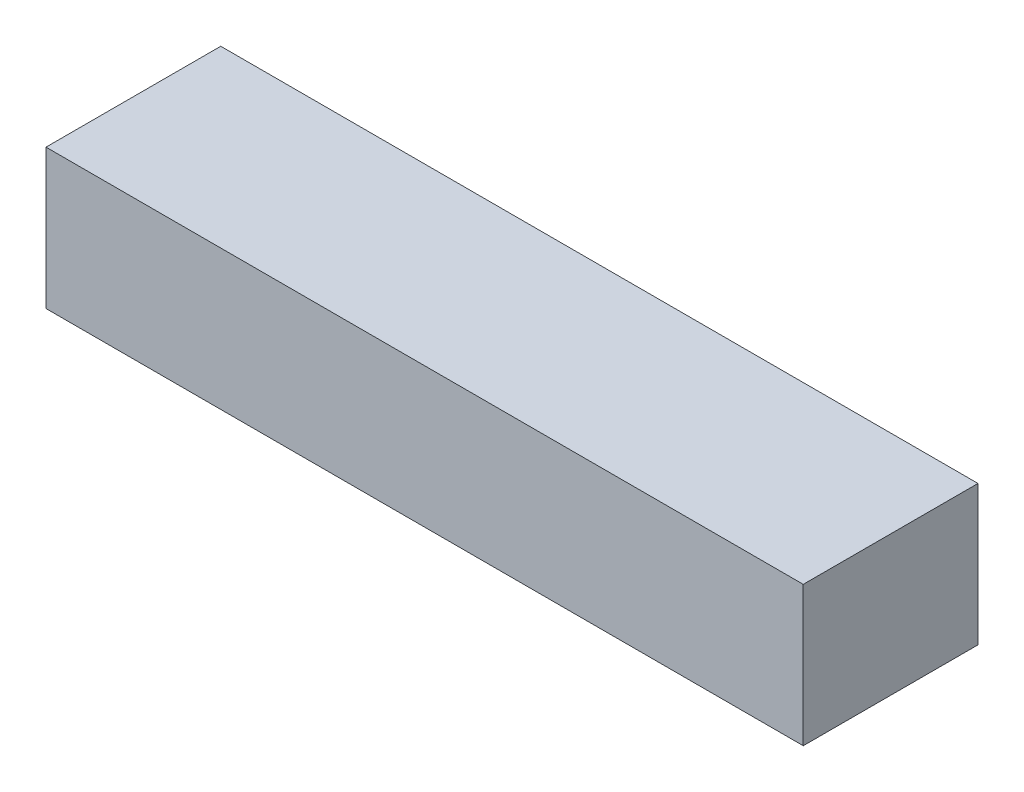
ISO-10303-21;
HEADER;
FILE_DESCRIPTION(('STEP AP214'),'2;1');
FILE_NAME('part.step','',(''),(''),'','','');
FILE_SCHEMA(('AUTOMOTIVE_DESIGN { 1 0 10303 214 1 1 1 1 }'));
ENDSEC;
DATA;
#1=APPLICATION_CONTEXT('core data for automotive mechanical design processes');
#2=APPLICATION_PROTOCOL_DEFINITION('international standard','automotive_design',2000,#1);
#3=PRODUCT_CONTEXT('',#1,'mechanical');
#4=PRODUCT('Part','Part','',(#3));
#5=PRODUCT_RELATED_PRODUCT_CATEGORY('part','',(#4));
#6=PRODUCT_DEFINITION_FORMATION('','',#4);
#7=PRODUCT_DEFINITION_CONTEXT('part definition',#1,'design');
#8=PRODUCT_DEFINITION('design','',#6,#7);
#9=PRODUCT_DEFINITION_SHAPE('','',#8);
#10=(LENGTH_UNIT() NAMED_UNIT(*) SI_UNIT(.MILLI.,.METRE.));
#11=(NAMED_UNIT(*) PLANE_ANGLE_UNIT() SI_UNIT($,.RADIAN.));
#12=(NAMED_UNIT(*) SI_UNIT($,.STERADIAN.) SOLID_ANGLE_UNIT());
#13=UNCERTAINTY_MEASURE_WITH_UNIT(LENGTH_MEASURE(1.E-05),#10,'distance_accuracy_value','');
#14=(GEOMETRIC_REPRESENTATION_CONTEXT(3) GLOBAL_UNCERTAINTY_ASSIGNED_CONTEXT((#13)) GLOBAL_UNIT_ASSIGNED_CONTEXT((#10,
#11,#12)) REPRESENTATION_CONTEXT('',''));
#15=CARTESIAN_POINT('',(0.,0.,0.));
#16=DIRECTION('',(0.,0.,1.));
#17=DIRECTION('',(1.,0.,0.));
#18=AXIS2_PLACEMENT_3D('',#15,#16,#17);
#19=CARTESIAN_POINT('',(1078.,1624.,-800.));
#20=DIRECTION('',(-1.,0.,0.));
#21=DIRECTION('',(0.,0.,1.));
#22=AXIS2_PLACEMENT_3D('',#19,#20,#21);
#23=PLANE('',#22);
#24=DIRECTION('',(0.,-1.,0.));
#25=VECTOR('',#24,1.);
#26=CARTESIAN_POINT('',(1078.,1624.,-770.));
#27=LINE('',#26,#25);
#28=CARTESIAN_POINT('',(1078.,1648.,-770.));
#29=VERTEX_POINT('',#28);
#30=CARTESIAN_POINT('',(1078.,1624.,-770.));
#31=VERTEX_POINT('',#30);
#32=EDGE_CURVE('E103',#29,#31,#27,.T.);
#33=ORIENTED_EDGE('',*,*,#32,.F.);
#34=DIRECTION('',(0.,0.,1.));
#35=VECTOR('',#34,1.);
#36=CARTESIAN_POINT('',(1078.,1648.,-800.));
#37=LINE('',#36,#35);
#38=CARTESIAN_POINT('',(1078.,1648.,-800.));
#39=VERTEX_POINT('',#38);
#40=EDGE_CURVE('E11',#39,#29,#37,.T.);
#41=ORIENTED_EDGE('',*,*,#40,.F.);
#42=DIRECTION('',(0.,-1.,0.));
#43=VECTOR('',#42,1.);
#44=CARTESIAN_POINT('',(1078.,1624.,-800.));
#45=LINE('',#44,#43);
#46=CARTESIAN_POINT('',(1078.,1624.,-800.));
#47=VERTEX_POINT('',#46);
#48=EDGE_CURVE('E97',#39,#47,#45,.T.);
#49=ORIENTED_EDGE('',*,*,#48,.T.);
#50=DIRECTION('',(0.,0.,1.));
#51=VECTOR('',#50,1.);
#52=CARTESIAN_POINT('',(1078.,1624.,-800.));
#53=LINE('',#52,#51);
#54=EDGE_CURVE('E42',#47,#31,#53,.T.);
#55=ORIENTED_EDGE('',*,*,#54,.T.);
#56=EDGE_LOOP('',(#33,#41,#49,#55));
#57=FACE_BOUND('',#56,.T.);
#58=ADVANCED_FACE('F39',(#57),#23,.T.);
#59=CARTESIAN_POINT('',(1078.,1648.,-800.));
#60=DIRECTION('',(0.,1.,0.));
#61=DIRECTION('',(0.,0.,1.));
#62=AXIS2_PLACEMENT_3D('',#59,#60,#61);
#63=PLANE('',#62);
#64=DIRECTION('',(-1.,0.,0.));
#65=VECTOR('',#64,1.);
#66=CARTESIAN_POINT('',(1078.,1648.,-770.));
#67=LINE('',#66,#65);
#68=CARTESIAN_POINT('',(1208.,1648.,-770.));
#69=VERTEX_POINT('',#68);
#70=EDGE_CURVE('E99',#69,#29,#67,.T.);
#71=ORIENTED_EDGE('',*,*,#70,.F.);
#72=DIRECTION('',(0.,0.,1.));
#73=VECTOR('',#72,1.);
#74=CARTESIAN_POINT('',(1208.,1648.,-800.));
#75=LINE('',#74,#73);
#76=CARTESIAN_POINT('',(1208.,1648.,-800.));
#77=VERTEX_POINT('',#76);
#78=EDGE_CURVE('E48',#77,#69,#75,.T.);
#79=ORIENTED_EDGE('',*,*,#78,.F.);
#80=DIRECTION('',(-1.,0.,0.));
#81=VECTOR('',#80,1.);
#82=CARTESIAN_POINT('',(1078.,1648.,-800.));
#83=LINE('',#82,#81);
#84=EDGE_CURVE('E94',#77,#39,#83,.T.);
#85=ORIENTED_EDGE('',*,*,#84,.T.);
#86=ORIENTED_EDGE('',*,*,#40,.T.);
#87=EDGE_LOOP('',(#71,#79,#85,#86));
#88=FACE_BOUND('',#87,.T.);
#89=ADVANCED_FACE('F113',(#88),#63,.T.);
#90=CARTESIAN_POINT('',(1208.,1624.,-800.));
#91=DIRECTION('',(1.,0.,0.));
#92=DIRECTION('',(0.,0.,-1.));
#93=AXIS2_PLACEMENT_3D('',#90,#91,#92);
#94=PLANE('',#93);
#95=DIRECTION('',(0.,1.,0.));
#96=VECTOR('',#95,1.);
#97=CARTESIAN_POINT('',(1208.,1624.,-770.));
#98=LINE('',#97,#96);
#99=CARTESIAN_POINT('',(1208.,1624.,-770.));
#100=VERTEX_POINT('',#99);
#101=EDGE_CURVE('E89',#100,#69,#98,.T.);
#102=ORIENTED_EDGE('',*,*,#101,.F.);
#103=DIRECTION('',(0.,0.,1.));
#104=VECTOR('',#103,1.);
#105=CARTESIAN_POINT('',(1208.,1624.,-800.));
#106=LINE('',#105,#104);
#107=CARTESIAN_POINT('',(1208.,1624.,-800.));
#108=VERTEX_POINT('',#107);
#109=EDGE_CURVE('E84',#108,#100,#106,.T.);
#110=ORIENTED_EDGE('',*,*,#109,.F.);
#111=DIRECTION('',(0.,1.,0.));
#112=VECTOR('',#111,1.);
#113=CARTESIAN_POINT('',(1208.,1624.,-800.));
#114=LINE('',#113,#112);
#115=EDGE_CURVE('E87',#108,#77,#114,.T.);
#116=ORIENTED_EDGE('',*,*,#115,.T.);
#117=ORIENTED_EDGE('',*,*,#78,.T.);
#118=EDGE_LOOP('',(#102,#110,#116,#117));
#119=FACE_BOUND('',#118,.T.);
#120=ADVANCED_FACE('F86',(#119),#94,.T.);
#121=CARTESIAN_POINT('',(1078.,1624.,-800.));
#122=DIRECTION('',(0.,-1.,0.));
#123=DIRECTION('',(0.,0.,-1.));
#124=AXIS2_PLACEMENT_3D('',#121,#122,#123);
#125=PLANE('',#124);
#126=DIRECTION('',(1.,0.,0.));
#127=VECTOR('',#126,1.);
#128=CARTESIAN_POINT('',(1078.,1624.,-770.));
#129=LINE('',#128,#127);
#130=EDGE_CURVE('E106',#31,#100,#129,.T.);
#131=ORIENTED_EDGE('',*,*,#130,.F.);
#132=ORIENTED_EDGE('',*,*,#54,.F.);
#133=DIRECTION('',(1.,0.,0.));
#134=VECTOR('',#133,1.);
#135=CARTESIAN_POINT('',(1078.,1624.,-800.));
#136=LINE('',#135,#134);
#137=EDGE_CURVE('E93',#47,#108,#136,.T.);
#138=ORIENTED_EDGE('',*,*,#137,.T.);
#139=ORIENTED_EDGE('',*,*,#109,.T.);
#140=EDGE_LOOP('',(#131,#132,#138,#139));
#141=FACE_BOUND('',#140,.T.);
#142=ADVANCED_FACE('F96',(#141),#125,.T.);
#143=CARTESIAN_POINT('',(0.,0.,-800.));
#144=DIRECTION('',(0.,0.,-1.));
#145=DIRECTION('',(-1.,0.,0.));
#146=AXIS2_PLACEMENT_3D('',#143,#144,#145);
#147=PLANE('',#146);
#148=ORIENTED_EDGE('',*,*,#48,.F.);
#149=ORIENTED_EDGE('',*,*,#84,.F.);
#150=ORIENTED_EDGE('',*,*,#115,.F.);
#151=ORIENTED_EDGE('',*,*,#137,.F.);
#152=EDGE_LOOP('',(#148,#149,#150,#151));
#153=FACE_BOUND('',#152,.T.);
#154=ADVANCED_FACE('F92',(#153),#147,.T.);
#155=CARTESIAN_POINT('',(0.,0.,-770.));
#156=DIRECTION('',(0.,0.,-1.));
#157=DIRECTION('',(-1.,0.,0.));
#158=AXIS2_PLACEMENT_3D('',#155,#156,#157);
#159=PLANE('',#158);
#160=ORIENTED_EDGE('',*,*,#32,.T.);
#161=ORIENTED_EDGE('',*,*,#130,.T.);
#162=ORIENTED_EDGE('',*,*,#101,.T.);
#163=ORIENTED_EDGE('',*,*,#70,.T.);
#164=EDGE_LOOP('',(#160,#161,#162,#163));
#165=FACE_BOUND('',#164,.T.);
#166=ADVANCED_FACE('F112',(#165),#159,.F.);
#167=CLOSED_SHELL('',(#58,#89,#120,#142,#154,#166));
#168=MANIFOLD_SOLID_BREP('B2',#167);
#169=ADVANCED_BREP_SHAPE_REPRESENTATION('',(#18,#168),#14);
#170=SHAPE_DEFINITION_REPRESENTATION(#9,#169);
ENDSEC;
END-ISO-10303-21;
